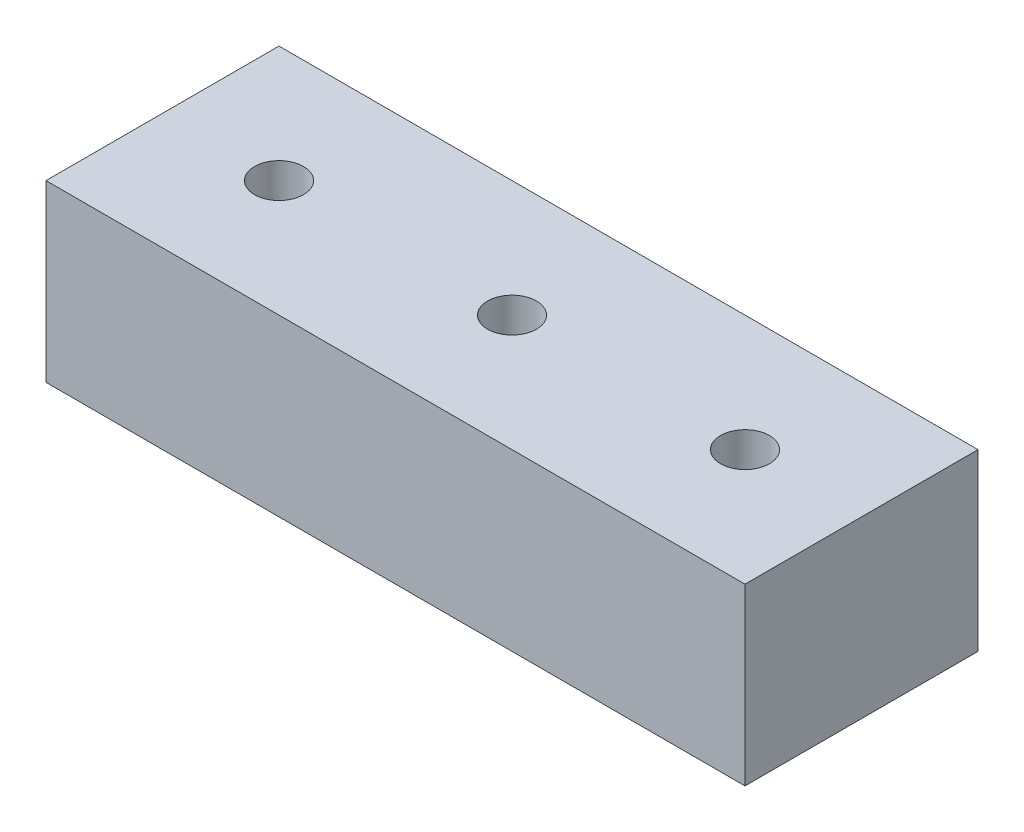
ISO-10303-21;
HEADER;
FILE_DESCRIPTION(('STEP AP214'),'2;1');
FILE_NAME('part.step','',(''),(''),'','','');
FILE_SCHEMA(('AUTOMOTIVE_DESIGN { 1 0 10303 214 1 1 1 1 }'));
ENDSEC;
DATA;
#1=APPLICATION_CONTEXT('core data for automotive mechanical design processes');
#2=APPLICATION_PROTOCOL_DEFINITION('international standard','automotive_design',2000,#1);
#3=PRODUCT_CONTEXT('',#1,'mechanical');
#4=PRODUCT('Part','Part','',(#3));
#5=PRODUCT_RELATED_PRODUCT_CATEGORY('part','',(#4));
#6=PRODUCT_DEFINITION_FORMATION('','',#4);
#7=PRODUCT_DEFINITION_CONTEXT('part definition',#1,'design');
#8=PRODUCT_DEFINITION('design','',#6,#7);
#9=PRODUCT_DEFINITION_SHAPE('','',#8);
#10=(LENGTH_UNIT() NAMED_UNIT(*) SI_UNIT(.MILLI.,.METRE.));
#11=(NAMED_UNIT(*) PLANE_ANGLE_UNIT() SI_UNIT($,.RADIAN.));
#12=(NAMED_UNIT(*) SI_UNIT($,.STERADIAN.) SOLID_ANGLE_UNIT());
#13=UNCERTAINTY_MEASURE_WITH_UNIT(LENGTH_MEASURE(1.E-05),#10,'distance_accuracy_value','');
#14=(GEOMETRIC_REPRESENTATION_CONTEXT(3) GLOBAL_UNCERTAINTY_ASSIGNED_CONTEXT((#13)) GLOBAL_UNIT_ASSIGNED_CONTEXT((#10,
#11,#12)) REPRESENTATION_CONTEXT('',''));
#15=CARTESIAN_POINT('',(0.,0.,0.));
#16=DIRECTION('',(0.,0.,1.));
#17=DIRECTION('',(1.,0.,0.));
#18=AXIS2_PLACEMENT_3D('',#15,#16,#17);
#19=CARTESIAN_POINT('',(0.,15.,0.));
#20=DIRECTION('',(0.,1.,0.));
#21=DIRECTION('',(0.,0.,1.));
#22=AXIS2_PLACEMENT_3D('',#19,#20,#21);
#23=PLANE('',#22);
#24=CARTESIAN_POINT('',(30.,15.,10.));
#25=DIRECTION('',(0.,1.,0.));
#26=DIRECTION('',(0.,0.,1.));
#27=AXIS2_PLACEMENT_3D('',#24,#25,#26);
#28=CIRCLE('',#27,2.1);
#29=CARTESIAN_POINT('',(30.,15.,12.1));
#30=VERTEX_POINT('',#29);
#31=EDGE_CURVE('E134',#30,#30,#28,.T.);
#32=ORIENTED_EDGE('',*,*,#31,.F.);
#33=EDGE_LOOP('',(#32));
#34=FACE_BOUND('',#33,.T.);
#35=DIRECTION('',(0.,0.,1.));
#36=VECTOR('',#35,1.);
#37=CARTESIAN_POINT('',(0.,15.,0.));
#38=LINE('',#37,#36);
#39=CARTESIAN_POINT('',(0.,15.,0.));
#40=VERTEX_POINT('',#39);
#41=CARTESIAN_POINT('',(0.,15.,20.));
#42=VERTEX_POINT('',#41);
#43=EDGE_CURVE('E92',#40,#42,#38,.T.);
#44=ORIENTED_EDGE('',*,*,#43,.T.);
#45=DIRECTION('',(1.,0.,0.));
#46=VECTOR('',#45,1.);
#47=CARTESIAN_POINT('',(0.,15.,20.));
#48=LINE('',#47,#46);
#49=CARTESIAN_POINT('',(60.,15.,20.));
#50=VERTEX_POINT('',#49);
#51=EDGE_CURVE('E87',#42,#50,#48,.T.);
#52=ORIENTED_EDGE('',*,*,#51,.T.);
#53=DIRECTION('',(0.,0.,-1.));
#54=VECTOR('',#53,1.);
#55=CARTESIAN_POINT('',(60.,15.,0.));
#56=LINE('',#55,#54);
#57=CARTESIAN_POINT('',(60.,15.,0.));
#58=VERTEX_POINT('',#57);
#59=EDGE_CURVE('E90',#50,#58,#56,.T.);
#60=ORIENTED_EDGE('',*,*,#59,.T.);
#61=DIRECTION('',(-1.,0.,0.));
#62=VECTOR('',#61,1.);
#63=CARTESIAN_POINT('',(0.,15.,0.));
#64=LINE('',#63,#62);
#65=EDGE_CURVE('E57',#58,#40,#64,.T.);
#66=ORIENTED_EDGE('',*,*,#65,.T.);
#67=EDGE_LOOP('',(#44,#52,#60,#66));
#68=FACE_BOUND('',#67,.T.);
#69=CARTESIAN_POINT('',(10.,15.,10.));
#70=DIRECTION('',(0.,1.,0.));
#71=DIRECTION('',(0.,0.,1.));
#72=AXIS2_PLACEMENT_3D('',#69,#70,#71);
#73=CIRCLE('',#72,2.1);
#74=CARTESIAN_POINT('',(10.,15.,12.1));
#75=VERTEX_POINT('',#74);
#76=EDGE_CURVE('E112',#75,#75,#73,.T.);
#77=ORIENTED_EDGE('',*,*,#76,.F.);
#78=EDGE_LOOP('',(#77));
#79=FACE_BOUND('',#78,.T.);
#80=CARTESIAN_POINT('',(50.,15.,10.));
#81=DIRECTION('',(0.,1.,0.));
#82=DIRECTION('',(0.,0.,1.));
#83=AXIS2_PLACEMENT_3D('',#80,#81,#82);
#84=CIRCLE('',#83,2.1);
#85=CARTESIAN_POINT('',(50.,15.,12.1));
#86=VERTEX_POINT('',#85);
#87=EDGE_CURVE('E142',#86,#86,#84,.T.);
#88=ORIENTED_EDGE('',*,*,#87,.F.);
#89=EDGE_LOOP('',(#88));
#90=FACE_BOUND('',#89,.T.);
#91=ADVANCED_FACE('F39',(#34,#68,#79,#90),#23,.T.);
#92=CARTESIAN_POINT('',(0.,0.,0.));
#93=DIRECTION('',(0.,1.,0.));
#94=DIRECTION('',(0.,0.,1.));
#95=AXIS2_PLACEMENT_3D('',#92,#93,#94);
#96=PLANE('',#95);
#97=DIRECTION('',(0.,0.,1.));
#98=VECTOR('',#97,1.);
#99=CARTESIAN_POINT('',(0.,0.,0.));
#100=LINE('',#99,#98);
#101=CARTESIAN_POINT('',(0.,0.,0.));
#102=VERTEX_POINT('',#101);
#103=CARTESIAN_POINT('',(0.,0.,20.));
#104=VERTEX_POINT('',#103);
#105=EDGE_CURVE('E108',#102,#104,#100,.T.);
#106=ORIENTED_EDGE('',*,*,#105,.F.);
#107=DIRECTION('',(-1.,0.,0.));
#108=VECTOR('',#107,1.);
#109=CARTESIAN_POINT('',(0.,0.,0.));
#110=LINE('',#109,#108);
#111=CARTESIAN_POINT('',(60.,0.,0.));
#112=VERTEX_POINT('',#111);
#113=EDGE_CURVE('E80',#112,#102,#110,.T.);
#114=ORIENTED_EDGE('',*,*,#113,.F.);
#115=DIRECTION('',(0.,0.,-1.));
#116=VECTOR('',#115,1.);
#117=CARTESIAN_POINT('',(60.,0.,0.));
#118=LINE('',#117,#116);
#119=CARTESIAN_POINT('',(60.,0.,20.));
#120=VERTEX_POINT('',#119);
#121=EDGE_CURVE('E74',#120,#112,#118,.T.);
#122=ORIENTED_EDGE('',*,*,#121,.F.);
#123=DIRECTION('',(1.,0.,0.));
#124=VECTOR('',#123,1.);
#125=CARTESIAN_POINT('',(0.,0.,20.));
#126=LINE('',#125,#124);
#127=EDGE_CURVE('E97',#104,#120,#126,.T.);
#128=ORIENTED_EDGE('',*,*,#127,.F.);
#129=EDGE_LOOP('',(#106,#114,#122,#128));
#130=FACE_BOUND('',#129,.T.);
#131=CARTESIAN_POINT('',(10.,0.,10.));
#132=DIRECTION('',(0.,1.,0.));
#133=DIRECTION('',(0.,0.,1.));
#134=AXIS2_PLACEMENT_3D('',#131,#132,#133);
#135=CIRCLE('',#134,2.1);
#136=CARTESIAN_POINT('',(10.,0.,12.1));
#137=VERTEX_POINT('',#136);
#138=EDGE_CURVE('E130',#137,#137,#135,.T.);
#139=ORIENTED_EDGE('',*,*,#138,.T.);
#140=EDGE_LOOP('',(#139));
#141=FACE_BOUND('',#140,.T.);
#142=CARTESIAN_POINT('',(30.,0.,10.));
#143=DIRECTION('',(0.,1.,0.));
#144=DIRECTION('',(0.,0.,1.));
#145=AXIS2_PLACEMENT_3D('',#142,#143,#144);
#146=CIRCLE('',#145,2.1);
#147=CARTESIAN_POINT('',(30.,0.,12.1));
#148=VERTEX_POINT('',#147);
#149=EDGE_CURVE('E138',#148,#148,#146,.T.);
#150=ORIENTED_EDGE('',*,*,#149,.T.);
#151=EDGE_LOOP('',(#150));
#152=FACE_BOUND('',#151,.T.);
#153=CARTESIAN_POINT('',(50.,0.,10.));
#154=DIRECTION('',(0.,1.,0.));
#155=DIRECTION('',(0.,0.,1.));
#156=AXIS2_PLACEMENT_3D('',#153,#154,#155);
#157=CIRCLE('',#156,2.1);
#158=CARTESIAN_POINT('',(50.,0.,12.1));
#159=VERTEX_POINT('',#158);
#160=EDGE_CURVE('E146',#159,#159,#157,.T.);
#161=ORIENTED_EDGE('',*,*,#160,.T.);
#162=EDGE_LOOP('',(#161));
#163=FACE_BOUND('',#162,.T.);
#164=ADVANCED_FACE('F125',(#130,#141,#152,#163),#96,.F.);
#165=CARTESIAN_POINT('',(0.,15.,0.));
#166=DIRECTION('',(1.,0.,0.));
#167=DIRECTION('',(0.,0.,-1.));
#168=AXIS2_PLACEMENT_3D('',#165,#166,#167);
#169=PLANE('',#168);
#170=ORIENTED_EDGE('',*,*,#105,.T.);
#171=DIRECTION('',(0.,-1.,0.));
#172=VECTOR('',#171,1.);
#173=CARTESIAN_POINT('',(0.,15.,20.));
#174=LINE('',#173,#172);
#175=EDGE_CURVE('E11',#42,#104,#174,.T.);
#176=ORIENTED_EDGE('',*,*,#175,.F.);
#177=ORIENTED_EDGE('',*,*,#43,.F.);
#178=DIRECTION('',(0.,-1.,0.));
#179=VECTOR('',#178,1.);
#180=CARTESIAN_POINT('',(0.,15.,0.));
#181=LINE('',#180,#179);
#182=EDGE_CURVE('E104',#40,#102,#181,.T.);
#183=ORIENTED_EDGE('',*,*,#182,.T.);
#184=EDGE_LOOP('',(#170,#176,#177,#183));
#185=FACE_BOUND('',#184,.T.);
#186=ADVANCED_FACE('F41',(#185),#169,.F.);
#187=CARTESIAN_POINT('',(0.,15.,20.));
#188=DIRECTION('',(0.,0.,-1.));
#189=DIRECTION('',(-1.,0.,0.));
#190=AXIS2_PLACEMENT_3D('',#187,#188,#189);
#191=PLANE('',#190);
#192=ORIENTED_EDGE('',*,*,#127,.T.);
#193=DIRECTION('',(0.,-1.,0.));
#194=VECTOR('',#193,1.);
#195=CARTESIAN_POINT('',(60.,15.,20.));
#196=LINE('',#195,#194);
#197=EDGE_CURVE('E49',#50,#120,#196,.T.);
#198=ORIENTED_EDGE('',*,*,#197,.F.);
#199=ORIENTED_EDGE('',*,*,#51,.F.);
#200=ORIENTED_EDGE('',*,*,#175,.T.);
#201=EDGE_LOOP('',(#192,#198,#199,#200));
#202=FACE_BOUND('',#201,.T.);
#203=ADVANCED_FACE('F96',(#202),#191,.F.);
#204=CARTESIAN_POINT('',(60.,15.,0.));
#205=DIRECTION('',(-1.,0.,0.));
#206=DIRECTION('',(0.,0.,1.));
#207=AXIS2_PLACEMENT_3D('',#204,#205,#206);
#208=PLANE('',#207);
#209=ORIENTED_EDGE('',*,*,#121,.T.);
#210=DIRECTION('',(0.,-1.,0.));
#211=VECTOR('',#210,1.);
#212=CARTESIAN_POINT('',(60.,15.,0.));
#213=LINE('',#212,#211);
#214=EDGE_CURVE('E99',#58,#112,#213,.T.);
#215=ORIENTED_EDGE('',*,*,#214,.F.);
#216=ORIENTED_EDGE('',*,*,#59,.F.);
#217=ORIENTED_EDGE('',*,*,#197,.T.);
#218=EDGE_LOOP('',(#209,#215,#216,#217));
#219=FACE_BOUND('',#218,.T.);
#220=ADVANCED_FACE('F100',(#219),#208,.F.);
#221=CARTESIAN_POINT('',(0.,15.,0.));
#222=DIRECTION('',(0.,0.,1.));
#223=DIRECTION('',(1.,0.,0.));
#224=AXIS2_PLACEMENT_3D('',#221,#222,#223);
#225=PLANE('',#224);
#226=ORIENTED_EDGE('',*,*,#113,.T.);
#227=ORIENTED_EDGE('',*,*,#182,.F.);
#228=ORIENTED_EDGE('',*,*,#65,.F.);
#229=ORIENTED_EDGE('',*,*,#214,.T.);
#230=EDGE_LOOP('',(#226,#227,#228,#229));
#231=FACE_BOUND('',#230,.T.);
#232=ADVANCED_FACE('F122',(#231),#225,.F.);
#233=CARTESIAN_POINT('',(10.,15.,10.));
#234=DIRECTION('',(0.,-1.,0.));
#235=DIRECTION('',(0.,0.,-1.));
#236=AXIS2_PLACEMENT_3D('',#233,#234,#235);
#237=CYLINDRICAL_SURFACE('',#236,2.1);
#238=ORIENTED_EDGE('',*,*,#76,.T.);
#239=EDGE_LOOP('',(#238));
#240=FACE_BOUND('',#239,.T.);
#241=ORIENTED_EDGE('',*,*,#138,.F.);
#242=EDGE_LOOP('',(#241));
#243=FACE_BOUND('',#242,.T.);
#244=ADVANCED_FACE('F166',(#240,#243),#237,.F.);
#245=CARTESIAN_POINT('',(30.,15.,10.));
#246=DIRECTION('',(0.,-1.,0.));
#247=DIRECTION('',(0.,0.,-1.));
#248=AXIS2_PLACEMENT_3D('',#245,#246,#247);
#249=CYLINDRICAL_SURFACE('',#248,2.1);
#250=ORIENTED_EDGE('',*,*,#31,.T.);
#251=EDGE_LOOP('',(#250));
#252=FACE_BOUND('',#251,.T.);
#253=ORIENTED_EDGE('',*,*,#149,.F.);
#254=EDGE_LOOP('',(#253));
#255=FACE_BOUND('',#254,.T.);
#256=ADVANCED_FACE('F212',(#252,#255),#249,.F.);
#257=CARTESIAN_POINT('',(50.,15.,10.));
#258=DIRECTION('',(0.,-1.,0.));
#259=DIRECTION('',(0.,0.,-1.));
#260=AXIS2_PLACEMENT_3D('',#257,#258,#259);
#261=CYLINDRICAL_SURFACE('',#260,2.1);
#262=ORIENTED_EDGE('',*,*,#87,.T.);
#263=EDGE_LOOP('',(#262));
#264=FACE_BOUND('',#263,.T.);
#265=ORIENTED_EDGE('',*,*,#160,.F.);
#266=EDGE_LOOP('',(#265));
#267=FACE_BOUND('',#266,.T.);
#268=ADVANCED_FACE('F154',(#264,#267),#261,.F.);
#269=CLOSED_SHELL('',(#91,#164,#186,#203,#220,#232,#244,#256,#268));
#270=MANIFOLD_SOLID_BREP('B2',#269);
#271=ADVANCED_BREP_SHAPE_REPRESENTATION('',(#18,#270),#14);
#272=SHAPE_DEFINITION_REPRESENTATION(#9,#271);
ENDSEC;
END-ISO-10303-21;
